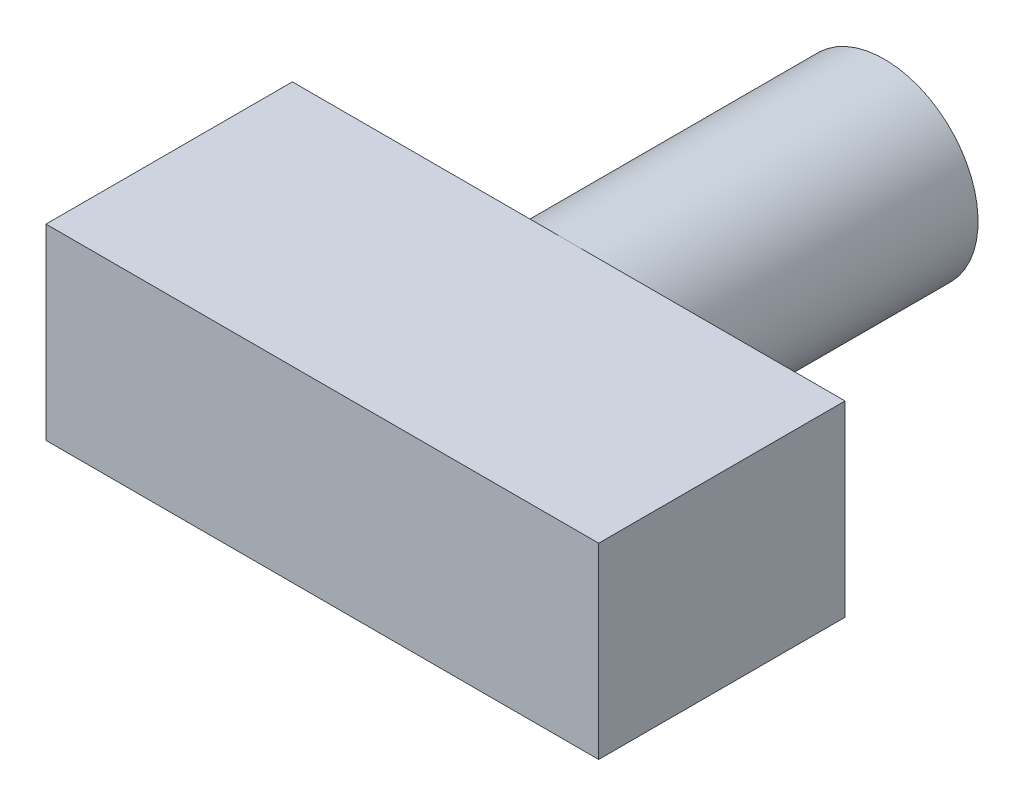
ISO-10303-21;
HEADER;
FILE_DESCRIPTION(('STEP AP214'),'2;1');
FILE_NAME('part.step','',(''),(''),'','','');
FILE_SCHEMA(('AUTOMOTIVE_DESIGN { 1 0 10303 214 1 1 1 1 }'));
ENDSEC;
DATA;
#1=APPLICATION_CONTEXT('core data for automotive mechanical design processes');
#2=APPLICATION_PROTOCOL_DEFINITION('international standard','automotive_design',2000,#1);
#3=PRODUCT_CONTEXT('',#1,'mechanical');
#4=PRODUCT('Part','Part','',(#3));
#5=PRODUCT_RELATED_PRODUCT_CATEGORY('part','',(#4));
#6=PRODUCT_DEFINITION_FORMATION('','',#4);
#7=PRODUCT_DEFINITION_CONTEXT('part definition',#1,'design');
#8=PRODUCT_DEFINITION('design','',#6,#7);
#9=PRODUCT_DEFINITION_SHAPE('','',#8);
#10=(LENGTH_UNIT() NAMED_UNIT(*) SI_UNIT(.MILLI.,.METRE.));
#11=(NAMED_UNIT(*) PLANE_ANGLE_UNIT() SI_UNIT($,.RADIAN.));
#12=(NAMED_UNIT(*) SI_UNIT($,.STERADIAN.) SOLID_ANGLE_UNIT());
#13=UNCERTAINTY_MEASURE_WITH_UNIT(LENGTH_MEASURE(1.E-05),#10,'distance_accuracy_value','');
#14=(GEOMETRIC_REPRESENTATION_CONTEXT(3) GLOBAL_UNCERTAINTY_ASSIGNED_CONTEXT((#13)) GLOBAL_UNIT_ASSIGNED_CONTEXT((#10,
#11,#12)) REPRESENTATION_CONTEXT('',''));
#15=CARTESIAN_POINT('',(0.,0.,0.));
#16=DIRECTION('',(0.,0.,1.));
#17=DIRECTION('',(1.,0.,0.));
#18=AXIS2_PLACEMENT_3D('',#15,#16,#17);
#19=CARTESIAN_POINT('',(76.0447711656927,-39.3219230769231,6.74));
#20=DIRECTION('',(0.,0.,1.));
#21=DIRECTION('',(1.,0.,0.));
#22=AXIS2_PLACEMENT_3D('',#19,#20,#21);
#23=PLANE('',#22);
#24=CARTESIAN_POINT('',(70.1447711656927,-37.3219230769231,6.74));
#25=DIRECTION('',(0.,0.,-1.));
#26=DIRECTION('',(-1.,0.,0.));
#27=AXIS2_PLACEMENT_3D('',#24,#25,#26);
#28=CIRCLE('',#27,2.);
#29=CARTESIAN_POINT('',(70.1447711656927,-35.3219230769231,6.74));
#30=VERTEX_POINT('',#29);
#31=CARTESIAN_POINT('',(70.1447711656927,-39.3219230769231,6.74));
#32=VERTEX_POINT('',#31);
#33=EDGE_CURVE('E41',#30,#32,#28,.T.);
#34=ORIENTED_EDGE('',*,*,#33,.F.);
#35=DIRECTION('',(-1.,0.,0.));
#36=VECTOR('',#35,1.);
#37=CARTESIAN_POINT('',(64.2447711656927,-35.3219230769231,6.74));
#38=LINE('',#37,#36);
#39=CARTESIAN_POINT('',(76.0447711656927,-35.3219230769231,6.74));
#40=VERTEX_POINT('',#39);
#41=EDGE_CURVE('E86',#40,#30,#38,.T.);
#42=ORIENTED_EDGE('',*,*,#41,.F.);
#43=DIRECTION('',(0.,1.,0.));
#44=VECTOR('',#43,1.);
#45=CARTESIAN_POINT('',(76.0447711656927,-35.3219230769231,6.74));
#46=LINE('',#45,#44);
#47=CARTESIAN_POINT('',(76.0447711656927,-39.3219230769231,6.74));
#48=VERTEX_POINT('',#47);
#49=EDGE_CURVE('E99',#48,#40,#46,.T.);
#50=ORIENTED_EDGE('',*,*,#49,.F.);
#51=DIRECTION('',(1.,0.,0.));
#52=VECTOR('',#51,1.);
#53=CARTESIAN_POINT('',(64.2447711656927,-39.3219230769231,6.74));
#54=LINE('',#53,#52);
#55=EDGE_CURVE('E75',#32,#48,#54,.T.);
#56=ORIENTED_EDGE('',*,*,#55,.F.);
#57=EDGE_LOOP('',(#34,#42,#50,#56));
#58=FACE_BOUND('',#57,.T.);
#59=ADVANCED_FACE('F31',(#58),#23,.F.);
#60=EDGE_CURVE('E11',#32,#30,#28,.T.);
#61=ORIENTED_EDGE('',*,*,#60,.F.);
#62=CARTESIAN_POINT('',(64.2447711656927,-39.3219230769231,6.74));
#63=VERTEX_POINT('',#62);
#64=EDGE_CURVE('E145',#63,#32,#54,.T.);
#65=ORIENTED_EDGE('',*,*,#64,.F.);
#66=DIRECTION('',(0.,-1.,0.));
#67=VECTOR('',#66,1.);
#68=CARTESIAN_POINT('',(64.2447711656927,-35.3219230769231,6.74));
#69=LINE('',#68,#67);
#70=CARTESIAN_POINT('',(64.2447711656927,-35.3219230769231,6.74));
#71=VERTEX_POINT('',#70);
#72=EDGE_CURVE('E95',#71,#63,#69,.T.);
#73=ORIENTED_EDGE('',*,*,#72,.F.);
#74=EDGE_CURVE('E88',#30,#71,#38,.T.);
#75=ORIENTED_EDGE('',*,*,#74,.F.);
#76=EDGE_LOOP('',(#61,#65,#73,#75));
#77=FACE_BOUND('',#76,.T.);
#78=ADVANCED_FACE('F98',(#77),#23,.F.);
#79=CARTESIAN_POINT('',(76.0447711656927,-35.3219230769231,12.));
#80=DIRECTION('',(-1.,0.,0.));
#81=DIRECTION('',(0.,0.,1.));
#82=AXIS2_PLACEMENT_3D('',#79,#80,#81);
#83=PLANE('',#82);
#84=ORIENTED_EDGE('',*,*,#49,.T.);
#85=DIRECTION('',(0.,0.,-1.));
#86=VECTOR('',#85,1.);
#87=CARTESIAN_POINT('',(76.0447711656927,-35.3219230769231,12.));
#88=LINE('',#87,#86);
#89=CARTESIAN_POINT('',(76.0447711656927,-35.3219230769231,12.));
#90=VERTEX_POINT('',#89);
#91=EDGE_CURVE('E35',#90,#40,#88,.T.);
#92=ORIENTED_EDGE('',*,*,#91,.F.);
#93=DIRECTION('',(0.,1.,0.));
#94=VECTOR('',#93,1.);
#95=CARTESIAN_POINT('',(76.0447711656927,-35.3219230769231,12.));
#96=LINE('',#95,#94);
#97=CARTESIAN_POINT('',(76.0447711656927,-39.3219230769231,12.));
#98=VERTEX_POINT('',#97);
#99=EDGE_CURVE('E147',#98,#90,#96,.T.);
#100=ORIENTED_EDGE('',*,*,#99,.F.);
#101=DIRECTION('',(0.,0.,-1.));
#102=VECTOR('',#101,1.);
#103=CARTESIAN_POINT('',(76.0447711656927,-39.3219230769231,12.));
#104=LINE('',#103,#102);
#105=EDGE_CURVE('E137',#98,#48,#104,.T.);
#106=ORIENTED_EDGE('',*,*,#105,.T.);
#107=EDGE_LOOP('',(#84,#92,#100,#106));
#108=FACE_BOUND('',#107,.T.);
#109=ADVANCED_FACE('F33',(#108),#83,.F.);
#110=CARTESIAN_POINT('',(64.2447711656927,-35.3219230769231,12.));
#111=DIRECTION('',(0.,-1.,0.));
#112=DIRECTION('',(0.,0.,-1.));
#113=AXIS2_PLACEMENT_3D('',#110,#111,#112);
#114=PLANE('',#113);
#115=ORIENTED_EDGE('',*,*,#41,.T.);
#116=ORIENTED_EDGE('',*,*,#74,.T.);
#117=DIRECTION('',(0.,0.,-1.));
#118=VECTOR('',#117,1.);
#119=CARTESIAN_POINT('',(64.2447711656927,-35.3219230769231,12.));
#120=LINE('',#119,#118);
#121=CARTESIAN_POINT('',(64.2447711656927,-35.3219230769231,12.));
#122=VERTEX_POINT('',#121);
#123=EDGE_CURVE('E151',#122,#71,#120,.T.);
#124=ORIENTED_EDGE('',*,*,#123,.F.);
#125=DIRECTION('',(-1.,0.,0.));
#126=VECTOR('',#125,1.);
#127=CARTESIAN_POINT('',(64.2447711656927,-35.3219230769231,12.));
#128=LINE('',#127,#126);
#129=EDGE_CURVE('E83',#90,#122,#128,.T.);
#130=ORIENTED_EDGE('',*,*,#129,.F.);
#131=ORIENTED_EDGE('',*,*,#91,.T.);
#132=EDGE_LOOP('',(#115,#116,#124,#130,#131));
#133=FACE_BOUND('',#132,.T.);
#134=ADVANCED_FACE('F87',(#133),#114,.F.);
#135=CARTESIAN_POINT('',(64.2447711656927,-35.3219230769231,12.));
#136=DIRECTION('',(1.,0.,0.));
#137=DIRECTION('',(0.,0.,-1.));
#138=AXIS2_PLACEMENT_3D('',#135,#136,#137);
#139=PLANE('',#138);
#140=ORIENTED_EDGE('',*,*,#72,.T.);
#141=DIRECTION('',(0.,0.,-1.));
#142=VECTOR('',#141,1.);
#143=CARTESIAN_POINT('',(64.2447711656927,-39.3219230769231,12.));
#144=LINE('',#143,#142);
#145=CARTESIAN_POINT('',(64.2447711656927,-39.3219230769231,12.));
#146=VERTEX_POINT('',#145);
#147=EDGE_CURVE('E149',#146,#63,#144,.T.);
#148=ORIENTED_EDGE('',*,*,#147,.F.);
#149=DIRECTION('',(0.,-1.,0.));
#150=VECTOR('',#149,1.);
#151=CARTESIAN_POINT('',(64.2447711656927,-35.3219230769231,12.));
#152=LINE('',#151,#150);
#153=EDGE_CURVE('E154',#122,#146,#152,.T.);
#154=ORIENTED_EDGE('',*,*,#153,.F.);
#155=ORIENTED_EDGE('',*,*,#123,.T.);
#156=EDGE_LOOP('',(#140,#148,#154,#155));
#157=FACE_BOUND('',#156,.T.);
#158=ADVANCED_FACE('F126',(#157),#139,.F.);
#159=CARTESIAN_POINT('',(64.2447711656927,-39.3219230769231,12.));
#160=DIRECTION('',(0.,1.,0.));
#161=DIRECTION('',(0.,0.,1.));
#162=AXIS2_PLACEMENT_3D('',#159,#160,#161);
#163=PLANE('',#162);
#164=ORIENTED_EDGE('',*,*,#64,.T.);
#165=ORIENTED_EDGE('',*,*,#55,.T.);
#166=ORIENTED_EDGE('',*,*,#105,.F.);
#167=DIRECTION('',(1.,0.,0.));
#168=VECTOR('',#167,1.);
#169=CARTESIAN_POINT('',(64.2447711656927,-39.3219230769231,12.));
#170=LINE('',#169,#168);
#171=EDGE_CURVE('E55',#146,#98,#170,.T.);
#172=ORIENTED_EDGE('',*,*,#171,.F.);
#173=ORIENTED_EDGE('',*,*,#147,.T.);
#174=EDGE_LOOP('',(#164,#165,#166,#172,#173));
#175=FACE_BOUND('',#174,.T.);
#176=ADVANCED_FACE('F115',(#175),#163,.F.);
#177=CARTESIAN_POINT('',(76.0447711656927,-39.3219230769231,12.));
#178=DIRECTION('',(0.,0.,1.));
#179=DIRECTION('',(1.,0.,0.));
#180=AXIS2_PLACEMENT_3D('',#177,#178,#179);
#181=PLANE('',#180);
#182=ORIENTED_EDGE('',*,*,#99,.T.);
#183=ORIENTED_EDGE('',*,*,#129,.T.);
#184=ORIENTED_EDGE('',*,*,#153,.T.);
#185=ORIENTED_EDGE('',*,*,#171,.T.);
#186=EDGE_LOOP('',(#182,#183,#184,#185));
#187=FACE_BOUND('',#186,.T.);
#188=ADVANCED_FACE('F106',(#187),#181,.T.);
#189=CARTESIAN_POINT('',(70.1447711656927,-37.3219230769231,0.));
#190=DIRECTION('',(0.,0.,1.));
#191=DIRECTION('',(1.,0.,0.));
#192=AXIS2_PLACEMENT_3D('',#189,#190,#191);
#193=CYLINDRICAL_SURFACE('',#192,2.);
#194=CARTESIAN_POINT('',(70.1447711656927,-37.3219230769231,0.));
#195=DIRECTION('',(0.,0.,-1.));
#196=DIRECTION('',(-1.,0.,0.));
#197=AXIS2_PLACEMENT_3D('',#194,#195,#196);
#198=CIRCLE('',#197,2.);
#199=CARTESIAN_POINT('',(68.1447711656927,-37.3219230769231,0.));
#200=VERTEX_POINT('',#199);
#201=EDGE_CURVE('E102',#200,#200,#198,.T.);
#202=ORIENTED_EDGE('',*,*,#201,.F.);
#203=EDGE_LOOP('',(#202));
#204=FACE_BOUND('',#203,.T.);
#205=ORIENTED_EDGE('',*,*,#33,.T.);
#206=ORIENTED_EDGE('',*,*,#60,.T.);
#207=EDGE_LOOP('',(#205,#206));
#208=FACE_BOUND('',#207,.T.);
#209=ADVANCED_FACE('F103',(#204,#208),#193,.T.);
#210=CARTESIAN_POINT('',(70.1447711656927,-37.3219230769231,0.));
#211=DIRECTION('',(0.,0.,-1.));
#212=DIRECTION('',(-1.,0.,0.));
#213=AXIS2_PLACEMENT_3D('',#210,#211,#212);
#214=PLANE('',#213);
#215=ORIENTED_EDGE('',*,*,#201,.T.);
#216=EDGE_LOOP('',(#215));
#217=FACE_BOUND('',#216,.T.);
#218=ADVANCED_FACE('F105',(#217),#214,.T.);
#219=CLOSED_SHELL('',(#59,#78,#109,#134,#158,#176,#188,#209,#218));
#220=MANIFOLD_SOLID_BREP('B2',#219);
#221=ADVANCED_BREP_SHAPE_REPRESENTATION('',(#18,#220),#14);
#222=SHAPE_DEFINITION_REPRESENTATION(#9,#221);
ENDSEC;
END-ISO-10303-21;
